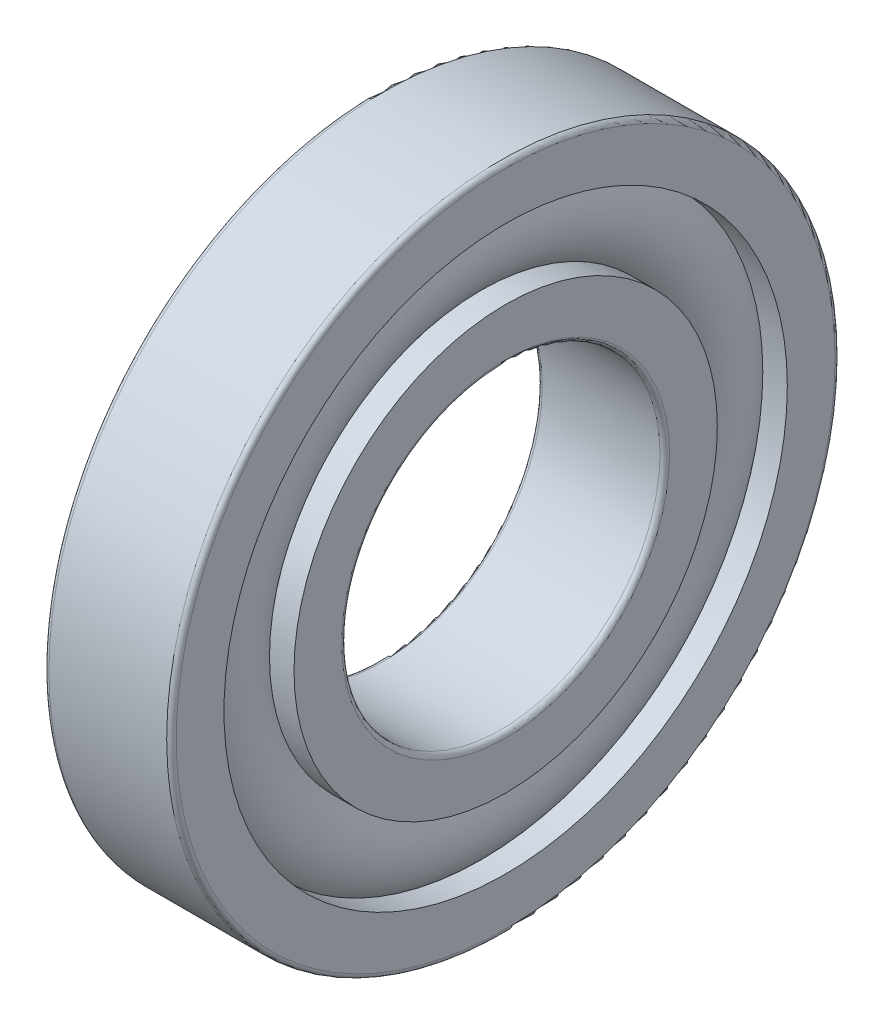
ISO-10303-21;
HEADER;
FILE_DESCRIPTION(('STEP AP214'),'2;1');
FILE_NAME('part.step','',(''),(''),'','','');
FILE_SCHEMA(('AUTOMOTIVE_DESIGN { 1 0 10303 214 1 1 1 1 }'));
ENDSEC;
DATA;
#1=APPLICATION_CONTEXT('core data for automotive mechanical design processes');
#2=APPLICATION_PROTOCOL_DEFINITION('international standard','automotive_design',2000,#1);
#3=PRODUCT_CONTEXT('',#1,'mechanical');
#4=PRODUCT('Part','Part','',(#3));
#5=PRODUCT_RELATED_PRODUCT_CATEGORY('part','',(#4));
#6=PRODUCT_DEFINITION_FORMATION('','',#4);
#7=PRODUCT_DEFINITION_CONTEXT('part definition',#1,'design');
#8=PRODUCT_DEFINITION('design','',#6,#7);
#9=PRODUCT_DEFINITION_SHAPE('','',#8);
#10=(LENGTH_UNIT() NAMED_UNIT(*) SI_UNIT(.MILLI.,.METRE.));
#11=(NAMED_UNIT(*) PLANE_ANGLE_UNIT() SI_UNIT($,.RADIAN.));
#12=(NAMED_UNIT(*) SI_UNIT($,.STERADIAN.) SOLID_ANGLE_UNIT());
#13=UNCERTAINTY_MEASURE_WITH_UNIT(LENGTH_MEASURE(1.E-05),#10,'distance_accuracy_value','');
#14=(GEOMETRIC_REPRESENTATION_CONTEXT(3) GLOBAL_UNCERTAINTY_ASSIGNED_CONTEXT((#13)) GLOBAL_UNIT_ASSIGNED_CONTEXT((#10,
#11,#12)) REPRESENTATION_CONTEXT('',''));
#15=CARTESIAN_POINT('',(0.,0.,0.));
#16=DIRECTION('',(0.,0.,1.));
#17=DIRECTION('',(1.,0.,0.));
#18=AXIS2_PLACEMENT_3D('',#15,#16,#17);
#19=CARTESIAN_POINT('',(0.,0.,0.));
#20=DIRECTION('',(-1.,0.,0.));
#21=DIRECTION('',(0.,0.,1.));
#22=AXIS2_PLACEMENT_3D('',#19,#20,#21);
#23=TOROIDAL_SURFACE('',#22,15.5,3.3);
#24=CARTESIAN_POINT('',(2.45967477524976,0.,0.));
#25=DIRECTION('',(-1.,0.,0.));
#26=DIRECTION('',(0.,0.,1.));
#27=AXIS2_PLACEMENT_3D('',#24,#25,#26);
#28=CIRCLE('',#27,17.7);
#29=CARTESIAN_POINT('',(2.45967477524976,0.,17.7));
#30=VERTEX_POINT('',#29);
#31=EDGE_CURVE('E35',#30,#30,#28,.F.);
#32=ORIENTED_EDGE('',*,*,#31,.T.);
#33=EDGE_LOOP('',(#32));
#34=FACE_BOUND('',#33,.T.);
#35=CARTESIAN_POINT('',(2.45967477524977,0.,0.));
#36=DIRECTION('',(-1.,0.,0.));
#37=DIRECTION('',(0.,0.,1.));
#38=AXIS2_PLACEMENT_3D('',#35,#36,#37);
#39=CIRCLE('',#38,13.3);
#40=CARTESIAN_POINT('',(2.45967477524977,0.,13.3));
#41=VERTEX_POINT('',#40);
#42=EDGE_CURVE('E10',#41,#41,#39,.T.);
#43=ORIENTED_EDGE('',*,*,#42,.T.);
#44=EDGE_LOOP('',(#43));
#45=FACE_BOUND('',#44,.T.);
#46=ADVANCED_FACE('F31',(#34,#45),#23,.T.);
#47=CARTESIAN_POINT('',(-20.6375,0.,0.));
#48=DIRECTION('',(1.,0.,0.));
#49=DIRECTION('',(0.,0.,-1.));
#50=AXIS2_PLACEMENT_3D('',#47,#48,#49);
#51=CYLINDRICAL_SURFACE('',#50,13.3);
#52=CARTESIAN_POINT('',(4.,0.,0.));
#53=DIRECTION('',(1.,0.,0.));
#54=DIRECTION('',(0.,0.,-1.));
#55=AXIS2_PLACEMENT_3D('',#52,#53,#54);
#56=CIRCLE('',#55,13.3);
#57=CARTESIAN_POINT('',(4.,0.,-13.3));
#58=VERTEX_POINT('',#57);
#59=EDGE_CURVE('E44',#58,#58,#56,.T.);
#60=ORIENTED_EDGE('',*,*,#59,.F.);
#61=EDGE_LOOP('',(#60));
#62=FACE_BOUND('',#61,.T.);
#63=ORIENTED_EDGE('',*,*,#42,.F.);
#64=EDGE_LOOP('',(#63));
#65=FACE_BOUND('',#64,.T.);
#66=ADVANCED_FACE('F83',(#62,#65),#51,.T.);
#67=CARTESIAN_POINT('',(-20.6375,0.,0.));
#68=DIRECTION('',(1.,0.,0.));
#69=DIRECTION('',(0.,0.,-1.));
#70=AXIS2_PLACEMENT_3D('',#67,#68,#69);
#71=CYLINDRICAL_SURFACE('',#70,13.3);
#72=CARTESIAN_POINT('',(-4.,0.,0.));
#73=DIRECTION('',(1.,0.,0.));
#74=DIRECTION('',(0.,0.,-1.));
#75=AXIS2_PLACEMENT_3D('',#72,#73,#74);
#76=CIRCLE('',#75,13.3);
#77=CARTESIAN_POINT('',(-4.,0.,-13.3));
#78=VERTEX_POINT('',#77);
#79=EDGE_CURVE('E53',#78,#78,#76,.T.);
#80=ORIENTED_EDGE('',*,*,#79,.T.);
#81=EDGE_LOOP('',(#80));
#82=FACE_BOUND('',#81,.T.);
#83=CARTESIAN_POINT('',(-2.45967477524977,0.,0.));
#84=DIRECTION('',(1.,0.,0.));
#85=DIRECTION('',(0.,0.,-1.));
#86=AXIS2_PLACEMENT_3D('',#83,#84,#85);
#87=CIRCLE('',#86,13.3);
#88=CARTESIAN_POINT('',(-2.45967477524977,0.,-13.3));
#89=VERTEX_POINT('',#88);
#90=EDGE_CURVE('E39',#89,#89,#87,.T.);
#91=ORIENTED_EDGE('',*,*,#90,.F.);
#92=EDGE_LOOP('',(#91));
#93=FACE_BOUND('',#92,.T.);
#94=ADVANCED_FACE('F86',(#82,#93),#71,.T.);
#95=CARTESIAN_POINT('',(4.,10.3,0.));
#96=DIRECTION('',(1.,0.,0.));
#97=DIRECTION('',(0.,0.,-1.));
#98=AXIS2_PLACEMENT_3D('',#95,#96,#97);
#99=PLANE('',#98);
#100=ORIENTED_EDGE('',*,*,#59,.T.);
#101=EDGE_LOOP('',(#100));
#102=FACE_BOUND('',#101,.T.);
#103=CARTESIAN_POINT('',(4.,0.,0.));
#104=DIRECTION('',(1.,0.,0.));
#105=DIRECTION('',(0.,0.,-1.));
#106=AXIS2_PLACEMENT_3D('',#103,#104,#105);
#107=CIRCLE('',#106,10.3);
#108=CARTESIAN_POINT('',(4.,0.,-10.3));
#109=VERTEX_POINT('',#108);
#110=EDGE_CURVE('E75',#109,#109,#107,.T.);
#111=ORIENTED_EDGE('',*,*,#110,.F.);
#112=EDGE_LOOP('',(#111));
#113=FACE_BOUND('',#112,.T.);
#114=ADVANCED_FACE('F80',(#102,#113),#99,.T.);
#115=CARTESIAN_POINT('',(3.7,0.,0.));
#116=DIRECTION('',(1.,0.,0.));
#117=DIRECTION('',(0.,0.,-1.));
#118=AXIS2_PLACEMENT_3D('',#115,#116,#117);
#119=TOROIDAL_SURFACE('',#118,10.3,0.300000000000003);
#120=ORIENTED_EDGE('',*,*,#110,.T.);
#121=EDGE_LOOP('',(#120));
#122=FACE_BOUND('',#121,.T.);
#123=CARTESIAN_POINT('',(3.7,0.,0.));
#124=DIRECTION('',(1.,0.,0.));
#125=DIRECTION('',(0.,0.,-1.));
#126=AXIS2_PLACEMENT_3D('',#123,#124,#125);
#127=CIRCLE('',#126,9.99999999999999);
#128=CARTESIAN_POINT('',(3.7,0.,-9.99999999999999));
#129=VERTEX_POINT('',#128);
#130=EDGE_CURVE('E72',#129,#129,#127,.T.);
#131=ORIENTED_EDGE('',*,*,#130,.F.);
#132=EDGE_LOOP('',(#131));
#133=FACE_BOUND('',#132,.T.);
#134=ADVANCED_FACE('F97',(#122,#133),#119,.T.);
#135=CARTESIAN_POINT('',(-20.6375,0.,0.));
#136=DIRECTION('',(1.,0.,0.));
#137=DIRECTION('',(0.,0.,-1.));
#138=AXIS2_PLACEMENT_3D('',#135,#136,#137);
#139=CYLINDRICAL_SURFACE('',#138,10.);
#140=ORIENTED_EDGE('',*,*,#130,.T.);
#141=EDGE_LOOP('',(#140));
#142=FACE_BOUND('',#141,.T.);
#143=CARTESIAN_POINT('',(-3.7,0.,0.));
#144=DIRECTION('',(1.,0.,0.));
#145=DIRECTION('',(0.,0.,-1.));
#146=AXIS2_PLACEMENT_3D('',#143,#144,#145);
#147=CIRCLE('',#146,10.);
#148=CARTESIAN_POINT('',(-3.7,0.,-10.));
#149=VERTEX_POINT('',#148);
#150=EDGE_CURVE('E69',#149,#149,#147,.T.);
#151=ORIENTED_EDGE('',*,*,#150,.F.);
#152=EDGE_LOOP('',(#151));
#153=FACE_BOUND('',#152,.T.);
#154=ADVANCED_FACE('F100',(#142,#153),#139,.F.);
#155=CARTESIAN_POINT('',(-3.7,0.,0.));
#156=DIRECTION('',(1.,0.,0.));
#157=DIRECTION('',(0.,0.,-1.));
#158=AXIS2_PLACEMENT_3D('',#155,#156,#157);
#159=TOROIDAL_SURFACE('',#158,10.3,0.300000000000003);
#160=ORIENTED_EDGE('',*,*,#150,.T.);
#161=EDGE_LOOP('',(#160));
#162=FACE_BOUND('',#161,.T.);
#163=CARTESIAN_POINT('',(-4.,0.,0.));
#164=DIRECTION('',(1.,0.,0.));
#165=DIRECTION('',(0.,0.,-1.));
#166=AXIS2_PLACEMENT_3D('',#163,#164,#165);
#167=CIRCLE('',#166,10.3);
#168=CARTESIAN_POINT('',(-4.,0.,-10.3));
#169=VERTEX_POINT('',#168);
#170=EDGE_CURVE('E66',#169,#169,#167,.T.);
#171=ORIENTED_EDGE('',*,*,#170,.F.);
#172=EDGE_LOOP('',(#171));
#173=FACE_BOUND('',#172,.T.);
#174=ADVANCED_FACE('F104',(#162,#173),#159,.T.);
#175=CARTESIAN_POINT('',(-4.,13.3,0.));
#176=DIRECTION('',(-1.,0.,0.));
#177=DIRECTION('',(0.,0.,1.));
#178=AXIS2_PLACEMENT_3D('',#175,#176,#177);
#179=PLANE('',#178);
#180=ORIENTED_EDGE('',*,*,#170,.T.);
#181=EDGE_LOOP('',(#180));
#182=FACE_BOUND('',#181,.T.);
#183=ORIENTED_EDGE('',*,*,#79,.F.);
#184=EDGE_LOOP('',(#183));
#185=FACE_BOUND('',#184,.T.);
#186=ADVANCED_FACE('F108',(#182,#185),#179,.T.);
#187=CARTESIAN_POINT('',(-2.45967477524976,0.,0.));
#188=DIRECTION('',(1.,0.,0.));
#189=DIRECTION('',(0.,0.,-1.));
#190=AXIS2_PLACEMENT_3D('',#187,#188,#189);
#191=CIRCLE('',#190,17.7);
#192=CARTESIAN_POINT('',(-2.45967477524976,0.,-17.7));
#193=VERTEX_POINT('',#192);
#194=EDGE_CURVE('E47',#193,#193,#191,.F.);
#195=ORIENTED_EDGE('',*,*,#194,.T.);
#196=EDGE_LOOP('',(#195));
#197=FACE_BOUND('',#196,.T.);
#198=ORIENTED_EDGE('',*,*,#90,.T.);
#199=EDGE_LOOP('',(#198));
#200=FACE_BOUND('',#199,.T.);
#201=ADVANCED_FACE('F33',(#197,#200),#23,.T.);
#202=CARTESIAN_POINT('',(-20.6375,0.,0.));
#203=DIRECTION('',(1.,0.,0.));
#204=DIRECTION('',(0.,0.,-1.));
#205=AXIS2_PLACEMENT_3D('',#202,#203,#204);
#206=CYLINDRICAL_SURFACE('',#205,17.7);
#207=CARTESIAN_POINT('',(4.,0.,0.));
#208=DIRECTION('',(1.,0.,0.));
#209=DIRECTION('',(0.,0.,-1.));
#210=AXIS2_PLACEMENT_3D('',#207,#208,#209);
#211=CIRCLE('',#210,17.7);
#212=CARTESIAN_POINT('',(4.,0.,-17.7));
#213=VERTEX_POINT('',#212);
#214=EDGE_CURVE('E49',#213,#213,#211,.T.);
#215=ORIENTED_EDGE('',*,*,#214,.T.);
#216=EDGE_LOOP('',(#215));
#217=FACE_BOUND('',#216,.T.);
#218=ORIENTED_EDGE('',*,*,#31,.F.);
#219=EDGE_LOOP('',(#218));
#220=FACE_BOUND('',#219,.T.);
#221=ADVANCED_FACE('F113',(#217,#220),#206,.F.);
#222=CARTESIAN_POINT('',(-20.6375,0.,0.));
#223=DIRECTION('',(1.,0.,0.));
#224=DIRECTION('',(0.,0.,-1.));
#225=AXIS2_PLACEMENT_3D('',#222,#223,#224);
#226=CYLINDRICAL_SURFACE('',#225,17.7);
#227=CARTESIAN_POINT('',(-4.,0.,0.));
#228=DIRECTION('',(1.,0.,0.));
#229=DIRECTION('',(0.,0.,-1.));
#230=AXIS2_PLACEMENT_3D('',#227,#228,#229);
#231=CIRCLE('',#230,17.7);
#232=CARTESIAN_POINT('',(-4.,0.,-17.7));
#233=VERTEX_POINT('',#232);
#234=EDGE_CURVE('E144',#233,#233,#231,.T.);
#235=ORIENTED_EDGE('',*,*,#234,.F.);
#236=EDGE_LOOP('',(#235));
#237=FACE_BOUND('',#236,.T.);
#238=ORIENTED_EDGE('',*,*,#194,.F.);
#239=EDGE_LOOP('',(#238));
#240=FACE_BOUND('',#239,.T.);
#241=ADVANCED_FACE('F116',(#237,#240),#226,.F.);
#242=CARTESIAN_POINT('',(4.,20.7,0.));
#243=DIRECTION('',(1.,0.,0.));
#244=DIRECTION('',(0.,0.,-1.));
#245=AXIS2_PLACEMENT_3D('',#242,#243,#244);
#246=PLANE('',#245);
#247=CARTESIAN_POINT('',(4.,0.,0.));
#248=DIRECTION('',(1.,0.,0.));
#249=DIRECTION('',(0.,0.,-1.));
#250=AXIS2_PLACEMENT_3D('',#247,#248,#249);
#251=CIRCLE('',#250,20.7);
#252=CARTESIAN_POINT('',(4.,0.,-20.7));
#253=VERTEX_POINT('',#252);
#254=EDGE_CURVE('E55',#253,#253,#251,.T.);
#255=ORIENTED_EDGE('',*,*,#254,.T.);
#256=EDGE_LOOP('',(#255));
#257=FACE_BOUND('',#256,.T.);
#258=ORIENTED_EDGE('',*,*,#214,.F.);
#259=EDGE_LOOP('',(#258));
#260=FACE_BOUND('',#259,.T.);
#261=ADVANCED_FACE('F117',(#257,#260),#246,.T.);
#262=CARTESIAN_POINT('',(3.7,0.,0.));
#263=DIRECTION('',(1.,0.,0.));
#264=DIRECTION('',(0.,0.,-1.));
#265=AXIS2_PLACEMENT_3D('',#262,#263,#264);
#266=TOROIDAL_SURFACE('',#265,20.7,0.299999999999999);
#267=CARTESIAN_POINT('',(3.7,0.,0.));
#268=DIRECTION('',(1.,0.,0.));
#269=DIRECTION('',(0.,0.,-1.));
#270=AXIS2_PLACEMENT_3D('',#267,#268,#269);
#271=CIRCLE('',#270,21.);
#272=CARTESIAN_POINT('',(3.7,0.,-21.));
#273=VERTEX_POINT('',#272);
#274=EDGE_CURVE('E60',#273,#273,#271,.T.);
#275=ORIENTED_EDGE('',*,*,#274,.T.);
#276=EDGE_LOOP('',(#275));
#277=FACE_BOUND('',#276,.T.);
#278=ORIENTED_EDGE('',*,*,#254,.F.);
#279=EDGE_LOOP('',(#278));
#280=FACE_BOUND('',#279,.T.);
#281=ADVANCED_FACE('F120',(#277,#280),#266,.T.);
#282=CARTESIAN_POINT('',(-20.6375,0.,0.));
#283=DIRECTION('',(1.,0.,0.));
#284=DIRECTION('',(0.,0.,-1.));
#285=AXIS2_PLACEMENT_3D('',#282,#283,#284);
#286=CYLINDRICAL_SURFACE('',#285,21.);
#287=CARTESIAN_POINT('',(-3.7,0.,0.));
#288=DIRECTION('',(1.,0.,0.));
#289=DIRECTION('',(0.,0.,-1.));
#290=AXIS2_PLACEMENT_3D('',#287,#288,#289);
#291=CIRCLE('',#290,21.);
#292=CARTESIAN_POINT('',(-3.7,0.,-21.));
#293=VERTEX_POINT('',#292);
#294=EDGE_CURVE('E148',#293,#293,#291,.T.);
#295=ORIENTED_EDGE('',*,*,#294,.T.);
#296=EDGE_LOOP('',(#295));
#297=FACE_BOUND('',#296,.T.);
#298=ORIENTED_EDGE('',*,*,#274,.F.);
#299=EDGE_LOOP('',(#298));
#300=FACE_BOUND('',#299,.T.);
#301=ADVANCED_FACE('F124',(#297,#300),#286,.T.);
#302=CARTESIAN_POINT('',(-3.7,0.,0.));
#303=DIRECTION('',(1.,0.,0.));
#304=DIRECTION('',(0.,0.,-1.));
#305=AXIS2_PLACEMENT_3D('',#302,#303,#304);
#306=TOROIDAL_SURFACE('',#305,20.7,0.299999999999999);
#307=CARTESIAN_POINT('',(-4.,0.,0.));
#308=DIRECTION('',(1.,0.,0.));
#309=DIRECTION('',(0.,0.,-1.));
#310=AXIS2_PLACEMENT_3D('',#307,#308,#309);
#311=CIRCLE('',#310,20.7);
#312=CARTESIAN_POINT('',(-4.,0.,-20.7));
#313=VERTEX_POINT('',#312);
#314=EDGE_CURVE('E145',#313,#313,#311,.T.);
#315=ORIENTED_EDGE('',*,*,#314,.T.);
#316=EDGE_LOOP('',(#315));
#317=FACE_BOUND('',#316,.T.);
#318=ORIENTED_EDGE('',*,*,#294,.F.);
#319=EDGE_LOOP('',(#318));
#320=FACE_BOUND('',#319,.T.);
#321=ADVANCED_FACE('F128',(#317,#320),#306,.T.);
#322=CARTESIAN_POINT('',(-4.,17.7,0.));
#323=DIRECTION('',(-1.,0.,0.));
#324=DIRECTION('',(0.,0.,1.));
#325=AXIS2_PLACEMENT_3D('',#322,#323,#324);
#326=PLANE('',#325);
#327=ORIENTED_EDGE('',*,*,#234,.T.);
#328=EDGE_LOOP('',(#327));
#329=FACE_BOUND('',#328,.T.);
#330=ORIENTED_EDGE('',*,*,#314,.F.);
#331=EDGE_LOOP('',(#330));
#332=FACE_BOUND('',#331,.T.);
#333=ADVANCED_FACE('F132',(#329,#332),#326,.T.);
#334=CLOSED_SHELL('',(#46,#66,#94,#114,#134,#154,#174,#186,#201,#221,#241,#261,#281,#301,#321,#333));
#335=MANIFOLD_SOLID_BREP('B2',#334);
#336=ADVANCED_BREP_SHAPE_REPRESENTATION('',(#18,#335),#14);
#337=SHAPE_DEFINITION_REPRESENTATION(#9,#336);
ENDSEC;
END-ISO-10303-21;
